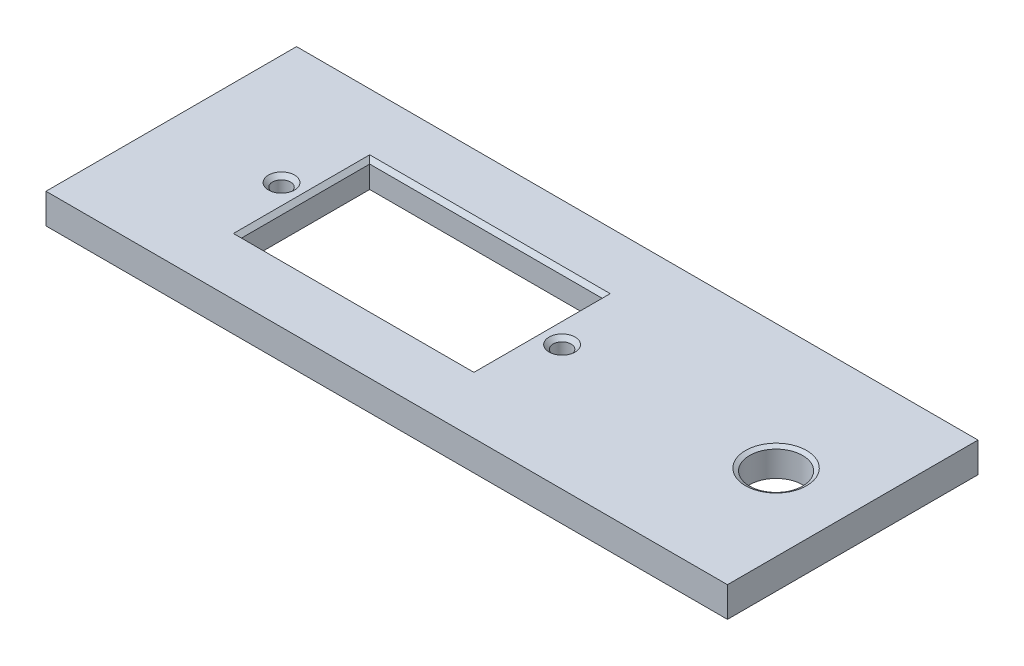
ISO-10303-21;
HEADER;
FILE_DESCRIPTION(('STEP AP214'),'2;1');
FILE_NAME('part.step','',(''),(''),'','','');
FILE_SCHEMA(('AUTOMOTIVE_DESIGN { 1 0 10303 214 1 1 1 1 }'));
ENDSEC;
DATA;
#1=APPLICATION_CONTEXT('core data for automotive mechanical design processes');
#2=APPLICATION_PROTOCOL_DEFINITION('international standard','automotive_design',2000,#1);
#3=PRODUCT_CONTEXT('',#1,'mechanical');
#4=PRODUCT('Part','Part','',(#3));
#5=PRODUCT_RELATED_PRODUCT_CATEGORY('part','',(#4));
#6=PRODUCT_DEFINITION_FORMATION('','',#4);
#7=PRODUCT_DEFINITION_CONTEXT('part definition',#1,'design');
#8=PRODUCT_DEFINITION('design','',#6,#7);
#9=PRODUCT_DEFINITION_SHAPE('','',#8);
#10=(LENGTH_UNIT() NAMED_UNIT(*) SI_UNIT(.MILLI.,.METRE.));
#11=(NAMED_UNIT(*) PLANE_ANGLE_UNIT() SI_UNIT($,.RADIAN.));
#12=(NAMED_UNIT(*) SI_UNIT($,.STERADIAN.) SOLID_ANGLE_UNIT());
#13=UNCERTAINTY_MEASURE_WITH_UNIT(LENGTH_MEASURE(1.E-05),#10,'distance_accuracy_value','');
#14=(GEOMETRIC_REPRESENTATION_CONTEXT(3) GLOBAL_UNCERTAINTY_ASSIGNED_CONTEXT((#13)) GLOBAL_UNIT_ASSIGNED_CONTEXT((#10,
#11,#12)) REPRESENTATION_CONTEXT('',''));
#15=CARTESIAN_POINT('',(0.,0.,0.));
#16=DIRECTION('',(0.,0.,1.));
#17=DIRECTION('',(1.,0.,0.));
#18=AXIS2_PLACEMENT_3D('',#15,#16,#17);
#19=CARTESIAN_POINT('',(0.,3.,12.5));
#20=DIRECTION('',(0.,0.,-1.));
#21=DIRECTION('',(-1.,0.,0.));
#22=AXIS2_PLACEMENT_3D('',#19,#20,#21);
#23=PLANE('',#22);
#24=DIRECTION('',(1.,0.,0.));
#25=VECTOR('',#24,1.);
#26=CARTESIAN_POINT('',(0.,0.,12.5));
#27=LINE('',#26,#25);
#28=CARTESIAN_POINT('',(-25.,0.,12.5));
#29=VERTEX_POINT('',#28);
#30=CARTESIAN_POINT('',(43.,0.,12.5));
#31=VERTEX_POINT('',#30);
#32=EDGE_CURVE('E220',#29,#31,#27,.T.);
#33=ORIENTED_EDGE('',*,*,#32,.T.);
#34=DIRECTION('',(0.,1.,0.));
#35=VECTOR('',#34,1.);
#36=CARTESIAN_POINT('',(43.,-30.8058436014987,12.5));
#37=LINE('',#36,#35);
#38=CARTESIAN_POINT('',(43.,3.,12.5));
#39=VERTEX_POINT('',#38);
#40=EDGE_CURVE('E157',#31,#39,#37,.T.);
#41=ORIENTED_EDGE('',*,*,#40,.T.);
#42=DIRECTION('',(1.,0.,0.));
#43=VECTOR('',#42,1.);
#44=CARTESIAN_POINT('',(0.,3.,12.5));
#45=LINE('',#44,#43);
#46=CARTESIAN_POINT('',(-25.,3.,12.5));
#47=VERTEX_POINT('',#46);
#48=EDGE_CURVE('E147',#47,#39,#45,.T.);
#49=ORIENTED_EDGE('',*,*,#48,.F.);
#50=DIRECTION('',(0.,-1.,0.));
#51=VECTOR('',#50,1.);
#52=CARTESIAN_POINT('',(-25.,3.,12.5));
#53=LINE('',#52,#51);
#54=EDGE_CURVE('E179',#47,#29,#53,.T.);
#55=ORIENTED_EDGE('',*,*,#54,.T.);
#56=EDGE_LOOP('',(#33,#41,#49,#55));
#57=FACE_BOUND('',#56,.T.);
#58=ADVANCED_FACE('F45',(#57),#23,.F.);
#59=CARTESIAN_POINT('',(0.,3.,-12.5));
#60=DIRECTION('',(0.,0.,-1.));
#61=DIRECTION('',(-1.,0.,0.));
#62=AXIS2_PLACEMENT_3D('',#59,#60,#61);
#63=PLANE('',#62);
#64=DIRECTION('',(1.,0.,0.));
#65=VECTOR('',#64,1.);
#66=CARTESIAN_POINT('',(0.,0.,-12.5));
#67=LINE('',#66,#65);
#68=CARTESIAN_POINT('',(-25.,0.,-12.5));
#69=VERTEX_POINT('',#68);
#70=CARTESIAN_POINT('',(43.,0.,-12.5));
#71=VERTEX_POINT('',#70);
#72=EDGE_CURVE('E224',#69,#71,#67,.T.);
#73=ORIENTED_EDGE('',*,*,#72,.F.);
#74=DIRECTION('',(0.,-1.,0.));
#75=VECTOR('',#74,1.);
#76=CARTESIAN_POINT('',(-25.,3.,-12.5));
#77=LINE('',#76,#75);
#78=CARTESIAN_POINT('',(-25.,3.,-12.5));
#79=VERTEX_POINT('',#78);
#80=EDGE_CURVE('E141',#79,#69,#77,.T.);
#81=ORIENTED_EDGE('',*,*,#80,.F.);
#82=DIRECTION('',(1.,0.,0.));
#83=VECTOR('',#82,1.);
#84=CARTESIAN_POINT('',(0.,3.,-12.5));
#85=LINE('',#84,#83);
#86=CARTESIAN_POINT('',(43.,3.,-12.5));
#87=VERTEX_POINT('',#86);
#88=EDGE_CURVE('E136',#79,#87,#85,.T.);
#89=ORIENTED_EDGE('',*,*,#88,.T.);
#90=DIRECTION('',(0.,1.,0.));
#91=VECTOR('',#90,1.);
#92=CARTESIAN_POINT('',(43.,-30.8058436014987,-12.5));
#93=LINE('',#92,#91);
#94=EDGE_CURVE('E139',#71,#87,#93,.T.);
#95=ORIENTED_EDGE('',*,*,#94,.F.);
#96=EDGE_LOOP('',(#73,#81,#89,#95));
#97=FACE_BOUND('',#96,.T.);
#98=ADVANCED_FACE('F138',(#97),#63,.T.);
#99=CARTESIAN_POINT('',(0.,3.,0.));
#100=DIRECTION('',(0.,1.,0.));
#101=DIRECTION('',(0.,0.,1.));
#102=AXIS2_PLACEMENT_3D('',#99,#100,#101);
#103=PLANE('',#102);
#104=CARTESIAN_POINT('',(35.35,3.,0.));
#105=DIRECTION('',(0.,1.,0.));
#106=DIRECTION('',(0.,0.,1.));
#107=AXIS2_PLACEMENT_3D('',#104,#105,#106);
#108=CIRCLE('',#107,3.05000000000001);
#109=CARTESIAN_POINT('',(35.35,3.,3.05000000000001));
#110=VERTEX_POINT('',#109);
#111=EDGE_CURVE('E54',#110,#110,#108,.F.);
#112=ORIENTED_EDGE('',*,*,#111,.T.);
#113=EDGE_LOOP('',(#112));
#114=FACE_BOUND('',#113,.T.);
#115=DIRECTION('',(-1.,0.,0.));
#116=VECTOR('',#115,1.);
#117=CARTESIAN_POINT('',(0.,3.,6.8));
#118=LINE('',#117,#116);
#119=CARTESIAN_POINT('',(12.,3.,6.8));
#120=VERTEX_POINT('',#119);
#121=CARTESIAN_POINT('',(-12.,3.,6.8));
#122=VERTEX_POINT('',#121);
#123=EDGE_CURVE('E237',#120,#122,#118,.T.);
#124=ORIENTED_EDGE('',*,*,#123,.T.);
#125=DIRECTION('',(0.,0.,1.));
#126=VECTOR('',#125,1.);
#127=CARTESIAN_POINT('',(-12.,3.,6.4));
#128=LINE('',#127,#126);
#129=CARTESIAN_POINT('',(-12.,3.,-6.8));
#130=VERTEX_POINT('',#129);
#131=EDGE_CURVE('E188',#130,#122,#128,.T.);
#132=ORIENTED_EDGE('',*,*,#131,.F.);
#133=DIRECTION('',(1.,0.,0.));
#134=VECTOR('',#133,1.);
#135=CARTESIAN_POINT('',(11.6,3.,-6.8));
#136=LINE('',#135,#134);
#137=CARTESIAN_POINT('',(12.,3.,-6.8));
#138=VERTEX_POINT('',#137);
#139=EDGE_CURVE('E233',#130,#138,#136,.T.);
#140=ORIENTED_EDGE('',*,*,#139,.T.);
#141=DIRECTION('',(0.,0.,1.));
#142=VECTOR('',#141,1.);
#143=CARTESIAN_POINT('',(12.,3.,6.4));
#144=LINE('',#143,#142);
#145=EDGE_CURVE('E235',#138,#120,#144,.T.);
#146=ORIENTED_EDGE('',*,*,#145,.T.);
#147=EDGE_LOOP('',(#124,#132,#140,#146));
#148=FACE_BOUND('',#147,.T.);
#149=CARTESIAN_POINT('',(14.,3.,0.));
#150=DIRECTION('',(0.,1.,0.));
#151=DIRECTION('',(0.,0.,1.));
#152=AXIS2_PLACEMENT_3D('',#149,#150,#151);
#153=CIRCLE('',#152,1.3);
#154=CARTESIAN_POINT('',(14.,3.,1.3));
#155=VERTEX_POINT('',#154);
#156=EDGE_CURVE('E239',#155,#155,#153,.F.);
#157=ORIENTED_EDGE('',*,*,#156,.T.);
#158=EDGE_LOOP('',(#157));
#159=FACE_BOUND('',#158,.T.);
#160=DIRECTION('',(0.,0.,-1.));
#161=VECTOR('',#160,1.);
#162=CARTESIAN_POINT('',(-25.,3.,0.));
#163=LINE('',#162,#161);
#164=EDGE_CURVE('E174',#47,#79,#163,.T.);
#165=ORIENTED_EDGE('',*,*,#164,.F.);
#166=ORIENTED_EDGE('',*,*,#48,.T.);
#167=DIRECTION('',(0.,0.,1.));
#168=VECTOR('',#167,1.);
#169=CARTESIAN_POINT('',(43.,3.,0.));
#170=LINE('',#169,#168);
#171=EDGE_CURVE('E154',#87,#39,#170,.T.);
#172=ORIENTED_EDGE('',*,*,#171,.F.);
#173=ORIENTED_EDGE('',*,*,#88,.F.);
#174=EDGE_LOOP('',(#165,#166,#172,#173));
#175=FACE_BOUND('',#174,.T.);
#176=CARTESIAN_POINT('',(-14.,3.,0.));
#177=DIRECTION('',(0.,-1.,0.));
#178=DIRECTION('',(0.,0.,1.));
#179=AXIS2_PLACEMENT_3D('',#176,#177,#178);
#180=CIRCLE('',#179,1.3);
#181=CARTESIAN_POINT('',(-14.,3.,1.3));
#182=VERTEX_POINT('',#181);
#183=EDGE_CURVE('E191',#182,#182,#180,.F.);
#184=ORIENTED_EDGE('',*,*,#183,.F.);
#185=EDGE_LOOP('',(#184));
#186=FACE_BOUND('',#185,.T.);
#187=ADVANCED_FACE('F159',(#114,#148,#159,#175,#186),#103,.T.);
#188=CARTESIAN_POINT('',(0.,0.,0.));
#189=DIRECTION('',(0.,1.,0.));
#190=DIRECTION('',(0.,0.,1.));
#191=AXIS2_PLACEMENT_3D('',#188,#189,#190);
#192=PLANE('',#191);
#193=CARTESIAN_POINT('',(35.35,0.,0.));
#194=DIRECTION('',(0.,1.,0.));
#195=DIRECTION('',(0.,0.,1.));
#196=AXIS2_PLACEMENT_3D('',#193,#194,#195);
#197=CIRCLE('',#196,3.05);
#198=CARTESIAN_POINT('',(35.35,0.,3.05));
#199=VERTEX_POINT('',#198);
#200=EDGE_CURVE('E11',#199,#199,#197,.T.);
#201=ORIENTED_EDGE('',*,*,#200,.T.);
#202=EDGE_LOOP('',(#201));
#203=FACE_BOUND('',#202,.T.);
#204=DIRECTION('',(0.,0.,-1.));
#205=VECTOR('',#204,1.);
#206=CARTESIAN_POINT('',(-12.,0.,0.));
#207=LINE('',#206,#205);
#208=CARTESIAN_POINT('',(-12.,0.,6.8));
#209=VERTEX_POINT('',#208);
#210=CARTESIAN_POINT('',(-12.,0.,-6.8));
#211=VERTEX_POINT('',#210);
#212=EDGE_CURVE('E194',#209,#211,#207,.T.);
#213=ORIENTED_EDGE('',*,*,#212,.F.);
#214=DIRECTION('',(1.,0.,0.));
#215=VECTOR('',#214,1.);
#216=CARTESIAN_POINT('',(0.,0.,6.8));
#217=LINE('',#216,#215);
#218=CARTESIAN_POINT('',(12.,0.,6.8));
#219=VERTEX_POINT('',#218);
#220=EDGE_CURVE('E246',#209,#219,#217,.T.);
#221=ORIENTED_EDGE('',*,*,#220,.T.);
#222=DIRECTION('',(0.,0.,-1.));
#223=VECTOR('',#222,1.);
#224=CARTESIAN_POINT('',(12.,0.,0.));
#225=LINE('',#224,#223);
#226=CARTESIAN_POINT('',(12.,0.,-6.8));
#227=VERTEX_POINT('',#226);
#228=EDGE_CURVE('E244',#219,#227,#225,.T.);
#229=ORIENTED_EDGE('',*,*,#228,.T.);
#230=DIRECTION('',(-1.,0.,0.));
#231=VECTOR('',#230,1.);
#232=CARTESIAN_POINT('',(0.,0.,-6.8));
#233=LINE('',#232,#231);
#234=EDGE_CURVE('E242',#227,#211,#233,.T.);
#235=ORIENTED_EDGE('',*,*,#234,.T.);
#236=EDGE_LOOP('',(#213,#221,#229,#235));
#237=FACE_BOUND('',#236,.T.);
#238=CARTESIAN_POINT('',(14.,0.,0.));
#239=DIRECTION('',(0.,1.,0.));
#240=DIRECTION('',(0.,0.,1.));
#241=AXIS2_PLACEMENT_3D('',#238,#239,#240);
#242=CIRCLE('',#241,1.30000000000001);
#243=CARTESIAN_POINT('',(14.,0.,-1.30000000000001));
#244=VERTEX_POINT('',#243);
#245=EDGE_CURVE('E249',#244,#244,#242,.T.);
#246=ORIENTED_EDGE('',*,*,#245,.T.);
#247=EDGE_LOOP('',(#246));
#248=FACE_BOUND('',#247,.T.);
#249=ORIENTED_EDGE('',*,*,#32,.F.);
#250=DIRECTION('',(0.,0.,-1.));
#251=VECTOR('',#250,1.);
#252=CARTESIAN_POINT('',(-25.,0.,0.));
#253=LINE('',#252,#251);
#254=EDGE_CURVE('E169',#29,#69,#253,.T.);
#255=ORIENTED_EDGE('',*,*,#254,.T.);
#256=ORIENTED_EDGE('',*,*,#72,.T.);
#257=DIRECTION('',(0.,0.,-1.));
#258=VECTOR('',#257,1.);
#259=CARTESIAN_POINT('',(43.,0.,0.));
#260=LINE('',#259,#258);
#261=EDGE_CURVE('E156',#31,#71,#260,.T.);
#262=ORIENTED_EDGE('',*,*,#261,.F.);
#263=EDGE_LOOP('',(#249,#255,#256,#262));
#264=FACE_BOUND('',#263,.T.);
#265=CARTESIAN_POINT('',(-14.,0.,0.));
#266=DIRECTION('',(0.,-1.,0.));
#267=DIRECTION('',(0.,0.,1.));
#268=AXIS2_PLACEMENT_3D('',#265,#266,#267);
#269=CIRCLE('',#268,1.30000000000001);
#270=CARTESIAN_POINT('',(-14.,0.,-1.30000000000001));
#271=VERTEX_POINT('',#270);
#272=EDGE_CURVE('E197',#271,#271,#269,.T.);
#273=ORIENTED_EDGE('',*,*,#272,.F.);
#274=EDGE_LOOP('',(#273));
#275=FACE_BOUND('',#274,.T.);
#276=ADVANCED_FACE('F403',(#203,#237,#248,#264,#275),#192,.F.);
#277=CARTESIAN_POINT('',(14.,0.,0.));
#278=DIRECTION('',(0.,1.,0.));
#279=DIRECTION('',(0.,0.,1.));
#280=AXIS2_PLACEMENT_3D('',#277,#278,#279);
#281=CYLINDRICAL_SURFACE('',#280,0.9);
#282=CARTESIAN_POINT('',(14.,2.6,0.));
#283=DIRECTION('',(0.,1.,0.));
#284=DIRECTION('',(0.,0.,1.));
#285=AXIS2_PLACEMENT_3D('',#282,#283,#284);
#286=CIRCLE('',#285,0.9);
#287=CARTESIAN_POINT('',(14.,2.6,0.9));
#288=VERTEX_POINT('',#287);
#289=EDGE_CURVE('E230',#288,#288,#286,.T.);
#290=ORIENTED_EDGE('',*,*,#289,.T.);
#291=EDGE_LOOP('',(#290));
#292=FACE_BOUND('',#291,.T.);
#293=CARTESIAN_POINT('',(14.,0.400000000000009,0.));
#294=DIRECTION('',(0.,1.,0.));
#295=DIRECTION('',(0.,0.,1.));
#296=AXIS2_PLACEMENT_3D('',#293,#294,#295);
#297=CIRCLE('',#296,0.9);
#298=CARTESIAN_POINT('',(14.,0.400000000000009,-0.9));
#299=VERTEX_POINT('',#298);
#300=EDGE_CURVE('E146',#299,#299,#297,.F.);
#301=ORIENTED_EDGE('',*,*,#300,.T.);
#302=EDGE_LOOP('',(#301));
#303=FACE_BOUND('',#302,.T.);
#304=ADVANCED_FACE('F406',(#292,#303),#281,.F.);
#305=CARTESIAN_POINT('',(11.6,0.,6.4));
#306=DIRECTION('',(1.,0.,0.));
#307=DIRECTION('',(0.,0.,-1.));
#308=AXIS2_PLACEMENT_3D('',#305,#306,#307);
#309=PLANE('',#308);
#310=DIRECTION('',(0.,1.,0.));
#311=VECTOR('',#310,1.);
#312=CARTESIAN_POINT('',(11.6,0.,-6.4));
#313=LINE('',#312,#311);
#314=CARTESIAN_POINT('',(11.6,0.400000000000001,-6.4));
#315=VERTEX_POINT('',#314);
#316=CARTESIAN_POINT('',(11.6,2.6,-6.4));
#317=VERTEX_POINT('',#316);
#318=EDGE_CURVE('E221',#315,#317,#313,.T.);
#319=ORIENTED_EDGE('',*,*,#318,.F.);
#320=DIRECTION('',(0.,0.,1.));
#321=VECTOR('',#320,1.);
#322=CARTESIAN_POINT('',(11.6,0.400000000000001,6.4));
#323=LINE('',#322,#321);
#324=CARTESIAN_POINT('',(11.6,0.400000000000001,6.4));
#325=VERTEX_POINT('',#324);
#326=EDGE_CURVE('E258',#315,#325,#323,.T.);
#327=ORIENTED_EDGE('',*,*,#326,.T.);
#328=DIRECTION('',(0.,1.,0.));
#329=VECTOR('',#328,1.);
#330=CARTESIAN_POINT('',(11.6,0.,6.4));
#331=LINE('',#330,#329);
#332=CARTESIAN_POINT('',(11.6,2.6,6.4));
#333=VERTEX_POINT('',#332);
#334=EDGE_CURVE('E218',#325,#333,#331,.T.);
#335=ORIENTED_EDGE('',*,*,#334,.T.);
#336=DIRECTION('',(0.,0.,-1.));
#337=VECTOR('',#336,1.);
#338=CARTESIAN_POINT('',(11.6,2.6,-6.4));
#339=LINE('',#338,#337);
#340=EDGE_CURVE('E61',#333,#317,#339,.T.);
#341=ORIENTED_EDGE('',*,*,#340,.T.);
#342=EDGE_LOOP('',(#319,#327,#335,#341));
#343=FACE_BOUND('',#342,.T.);
#344=ADVANCED_FACE('F393',(#343),#309,.F.);
#345=CARTESIAN_POINT('',(-11.6,0.,6.4));
#346=DIRECTION('',(0.,0.,1.));
#347=DIRECTION('',(1.,0.,0.));
#348=AXIS2_PLACEMENT_3D('',#345,#346,#347);
#349=PLANE('',#348);
#350=ORIENTED_EDGE('',*,*,#334,.F.);
#351=DIRECTION('',(-1.,0.,0.));
#352=VECTOR('',#351,1.);
#353=CARTESIAN_POINT('',(-11.6,0.400000000000001,6.4));
#354=LINE('',#353,#352);
#355=CARTESIAN_POINT('',(-11.6,0.400000000000001,6.4));
#356=VERTEX_POINT('',#355);
#357=EDGE_CURVE('E255',#325,#356,#354,.T.);
#358=ORIENTED_EDGE('',*,*,#357,.T.);
#359=DIRECTION('',(0.,1.,0.));
#360=VECTOR('',#359,1.);
#361=CARTESIAN_POINT('',(-11.6,0.,6.4));
#362=LINE('',#361,#360);
#363=CARTESIAN_POINT('',(-11.6,2.6,6.4));
#364=VERTEX_POINT('',#363);
#365=EDGE_CURVE('E166',#356,#364,#362,.T.);
#366=ORIENTED_EDGE('',*,*,#365,.T.);
#367=DIRECTION('',(1.,0.,0.));
#368=VECTOR('',#367,1.);
#369=CARTESIAN_POINT('',(11.6,2.6,6.4));
#370=LINE('',#369,#368);
#371=EDGE_CURVE('E252',#364,#333,#370,.T.);
#372=ORIENTED_EDGE('',*,*,#371,.T.);
#373=EDGE_LOOP('',(#350,#358,#366,#372));
#374=FACE_BOUND('',#373,.T.);
#375=ADVANCED_FACE('F386',(#374),#349,.F.);
#376=CARTESIAN_POINT('',(-11.6,0.,-6.4));
#377=DIRECTION('',(0.,0.,-1.));
#378=DIRECTION('',(-1.,0.,0.));
#379=AXIS2_PLACEMENT_3D('',#376,#377,#378);
#380=PLANE('',#379);
#381=DIRECTION('',(-1.,0.,0.));
#382=VECTOR('',#381,1.);
#383=CARTESIAN_POINT('',(0.,2.6,-6.4));
#384=LINE('',#383,#382);
#385=CARTESIAN_POINT('',(-11.6,2.6,-6.4));
#386=VERTEX_POINT('',#385);
#387=EDGE_CURVE('E260',#317,#386,#384,.T.);
#388=ORIENTED_EDGE('',*,*,#387,.T.);
#389=DIRECTION('',(0.,1.,0.));
#390=VECTOR('',#389,1.);
#391=CARTESIAN_POINT('',(-11.6,0.,-6.4));
#392=LINE('',#391,#390);
#393=CARTESIAN_POINT('',(-11.6,0.400000000000001,-6.4));
#394=VERTEX_POINT('',#393);
#395=EDGE_CURVE('E170',#394,#386,#392,.T.);
#396=ORIENTED_EDGE('',*,*,#395,.F.);
#397=DIRECTION('',(1.,0.,0.));
#398=VECTOR('',#397,1.);
#399=CARTESIAN_POINT('',(-11.6,0.400000000000001,-6.4));
#400=LINE('',#399,#398);
#401=EDGE_CURVE('E68',#394,#315,#400,.T.);
#402=ORIENTED_EDGE('',*,*,#401,.T.);
#403=ORIENTED_EDGE('',*,*,#318,.T.);
#404=EDGE_LOOP('',(#388,#396,#402,#403));
#405=FACE_BOUND('',#404,.T.);
#406=ADVANCED_FACE('F316',(#405),#380,.F.);
#407=CARTESIAN_POINT('',(14.,2.6,0.));
#408=DIRECTION('',(0.,1.,0.));
#409=DIRECTION('',(0.,0.,1.));
#410=AXIS2_PLACEMENT_3D('',#407,#408,#409);
#411=CONICAL_SURFACE('',#410,0.9,0.785398163397449);
#412=ORIENTED_EDGE('',*,*,#156,.F.);
#413=EDGE_LOOP('',(#412));
#414=FACE_BOUND('',#413,.T.);
#415=ORIENTED_EDGE('',*,*,#289,.F.);
#416=EDGE_LOOP('',(#415));
#417=FACE_BOUND('',#416,.T.);
#418=ADVANCED_FACE('F309',(#414,#417),#411,.F.);
#419=CARTESIAN_POINT('',(14.,0.,0.));
#420=DIRECTION('',(0.,-1.,0.));
#421=DIRECTION('',(0.,0.,-1.));
#422=AXIS2_PLACEMENT_3D('',#419,#420,#421);
#423=CONICAL_SURFACE('',#422,1.30000000000001,0.785398163397444);
#424=CARTESIAN_POINT('',(14.,0.400000000000009,-0.9));
#425=CARTESIAN_POINT('',(14.,0.395833333333343,-0.904166666666667));
#426=CARTESIAN_POINT('',(14.,0.391666666666676,-0.908333333333334));
#427=CARTESIAN_POINT('',(14.,0.383333333333342,-0.916666666666667));
#428=CARTESIAN_POINT('',(14.,0.379166666666675,-0.920833333333334));
#429=CARTESIAN_POINT('',(14.,0.370833333333342,-0.929166666666667));
#430=CARTESIAN_POINT('',(14.,0.366666666666675,-0.933333333333334));
#431=CARTESIAN_POINT('',(14.,0.358333333333342,-0.941666666666667));
#432=CARTESIAN_POINT('',(14.,0.354166666666675,-0.945833333333334));
#433=CARTESIAN_POINT('',(14.,0.345833333333341,-0.954166666666668));
#434=CARTESIAN_POINT('',(14.,0.341666666666675,-0.958333333333334));
#435=CARTESIAN_POINT('',(14.,0.333333333333341,-0.966666666666668));
#436=CARTESIAN_POINT('',(14.,0.329166666666674,-0.970833333333335));
#437=CARTESIAN_POINT('',(14.,0.320833333333341,-0.979166666666668));
#438=CARTESIAN_POINT('',(14.,0.316666666666674,-0.983333333333335));
#439=CARTESIAN_POINT('',(14.,0.308333333333341,-0.991666666666668));
#440=CARTESIAN_POINT('',(14.,0.304166666666674,-0.995833333333335));
#441=CARTESIAN_POINT('',(14.,0.29583333333334,-1.00416666666667));
#442=CARTESIAN_POINT('',(14.,0.291666666666673,-1.00833333333334));
#443=CARTESIAN_POINT('',(14.,0.28333333333334,-1.01666666666667));
#444=CARTESIAN_POINT('',(14.,0.279166666666673,-1.02083333333334));
#445=CARTESIAN_POINT('',(14.,0.27083333333334,-1.02916666666667));
#446=CARTESIAN_POINT('',(14.,0.266666666666673,-1.03333333333334));
#447=CARTESIAN_POINT('',(14.,0.258333333333339,-1.04166666666667));
#448=CARTESIAN_POINT('',(14.,0.254166666666673,-1.04583333333334));
#449=CARTESIAN_POINT('',(14.,0.245833333333339,-1.05416666666667));
#450=CARTESIAN_POINT('',(14.,0.241666666666672,-1.05833333333334));
#451=CARTESIAN_POINT('',(14.,0.233333333333339,-1.06666666666667));
#452=CARTESIAN_POINT('',(14.,0.229166666666672,-1.07083333333334));
#453=CARTESIAN_POINT('',(14.,0.220833333333338,-1.07916666666667));
#454=CARTESIAN_POINT('',(14.,0.216666666666672,-1.08333333333334));
#455=CARTESIAN_POINT('',(14.,0.208333333333338,-1.09166666666667));
#456=CARTESIAN_POINT('',(14.,0.204166666666671,-1.09583333333334));
#457=CARTESIAN_POINT('',(14.,0.195833333333338,-1.10416666666667));
#458=CARTESIAN_POINT('',(14.,0.191666666666671,-1.10833333333334));
#459=CARTESIAN_POINT('',(14.,0.183333333333338,-1.11666666666667));
#460=CARTESIAN_POINT('',(14.,0.179166666666671,-1.12083333333334));
#461=CARTESIAN_POINT('',(14.,0.170833333333337,-1.12916666666667));
#462=CARTESIAN_POINT('',(14.,0.166666666666671,-1.13333333333334));
#463=CARTESIAN_POINT('',(14.,0.158333333333337,-1.14166666666667));
#464=CARTESIAN_POINT('',(14.,0.15416666666667,-1.14583333333334));
#465=CARTESIAN_POINT('',(14.,0.145833333333337,-1.15416666666667));
#466=CARTESIAN_POINT('',(14.,0.14166666666667,-1.15833333333334));
#467=CARTESIAN_POINT('',(14.,0.133333333333336,-1.16666666666667));
#468=CARTESIAN_POINT('',(14.,0.12916666666667,-1.17083333333334));
#469=CARTESIAN_POINT('',(14.,0.120833333333336,-1.17916666666667));
#470=CARTESIAN_POINT('',(14.,0.116666666666669,-1.18333333333334));
#471=CARTESIAN_POINT('',(14.,0.108333333333336,-1.19166666666667));
#472=CARTESIAN_POINT('',(14.,0.104166666666669,-1.19583333333334));
#473=CARTESIAN_POINT('',(14.,0.0958333333333356,-1.20416666666667));
#474=CARTESIAN_POINT('',(14.,0.0916666666666688,-1.20833333333334));
#475=CARTESIAN_POINT('',(14.,0.0833333333333353,-1.21666666666667));
#476=CARTESIAN_POINT('',(14.,0.0791666666666685,-1.22083333333334));
#477=CARTESIAN_POINT('',(14.,0.070833333333335,-1.22916666666667));
#478=CARTESIAN_POINT('',(14.,0.0666666666666682,-1.23333333333334));
#479=CARTESIAN_POINT('',(14.,0.0583333333333347,-1.24166666666667));
#480=CARTESIAN_POINT('',(14.,0.0541666666666679,-1.24583333333334));
#481=CARTESIAN_POINT('',(14.,0.0458333333333344,-1.25416666666667));
#482=CARTESIAN_POINT('',(14.,0.0416666666666676,-1.25833333333334));
#483=CARTESIAN_POINT('',(14.,0.0333333333333341,-1.26666666666667));
#484=CARTESIAN_POINT('',(14.,0.0291666666666674,-1.27083333333334));
#485=CARTESIAN_POINT('',(14.,0.0208333333333338,-1.27916666666667));
#486=CARTESIAN_POINT('',(14.,0.0166666666666671,-1.28333333333334));
#487=CARTESIAN_POINT('',(14.,0.00833333333333353,-1.29166666666667));
#488=CARTESIAN_POINT('',(14.,0.00416666666666677,-1.29583333333334));
#489=CARTESIAN_POINT('',(14.,0.,-1.30000000000001));
#490=B_SPLINE_CURVE_WITH_KNOTS('',3,(#424,#425,#426,#427,#428,#429,#430,#431,#432,#433,#434,
#435,#436,#437,#438,#439,#440,#441,#442,#443,#444,#445,#446,#447,#448,#449,#450,#451,#452,#453,
#454,#455,#456,#457,#458,#459,#460,#461,#462,#463,#464,#465,#466,#467,#468,#469,#470,#471,#472,
#473,#474,#475,#476,#477,#478,#479,#480,#481,#482,#483,#484,#485,#486,#487,#488,#489),
.UNSPECIFIED.,.F.,.F.,(4,2,2,2,2,2,2,2,2,2,2,2,2,2,2,2,2,2,2,2,2,2,2,2,2,2,2,2,2,2,2,2,4),(0.,
0.017677669529664,0.0353553390593281,0.053033008588992,0.0707106781186561,0.0883883476483201,
0.106066017177984,0.123743686707648,0.141421356237312,0.159099025766976,0.17677669529664,
0.194454364826304,0.212132034355968,0.229809703885632,0.247487373415296,0.26516504294496,
0.282842712474624,0.300520382004288,0.318198051533952,0.335875721063617,0.353553390593281,
0.371231060122944,0.388908729652608,0.406586399182272,0.424264068711937,0.441941738241601,
0.459619407771265,0.477297077300929,0.494974746830593,0.512652416360257,0.530330085889921,
0.548007755419585,0.565685424949249),.UNSPECIFIED.);
#491=EDGE_CURVE('BSEAM315',#299,#244,#490,.T.);
#492=ORIENTED_EDGE('',*,*,#300,.F.);
#493=ORIENTED_EDGE('',*,*,#245,.F.);
#494=ORIENTED_EDGE('',*,*,#491,.T.);
#495=ORIENTED_EDGE('',*,*,#491,.F.);
#496=EDGE_LOOP('',(#492,#494,#493,#495));
#497=FACE_BOUND('',#496,.T.);
#498=ADVANCED_FACE('F315',(#497),#423,.F.);
#499=CARTESIAN_POINT('',(0.,0.,-6.8));
#500=DIRECTION('',(0.,0.707106781186544,-0.707106781186551));
#501=DIRECTION('',(-1.,0.,0.));
#502=AXIS2_PLACEMENT_3D('',#499,#500,#501);
#503=PLANE('',#502);
#504=ORIENTED_EDGE('',*,*,#401,.F.);
#505=DIRECTION('',(0.577350269189624,0.577350269189629,0.577350269189624));
#506=VECTOR('',#505,1.);
#507=CARTESIAN_POINT('',(-9.73333333333334,2.26666666666667,-4.53333333333335));
#508=LINE('',#507,#506);
#509=EDGE_CURVE('E173',#394,#211,#508,.F.);
#510=ORIENTED_EDGE('',*,*,#509,.T.);
#511=ORIENTED_EDGE('',*,*,#234,.F.);
#512=DIRECTION('',(-0.577350269189624,0.577350269189629,0.577350269189624));
#513=VECTOR('',#512,1.);
#514=CARTESIAN_POINT('',(9.73333333333334,2.26666666666667,-4.53333333333335));
#515=LINE('',#514,#513);
#516=EDGE_CURVE('E223',#315,#227,#515,.F.);
#517=ORIENTED_EDGE('',*,*,#516,.F.);
#518=EDGE_LOOP('',(#504,#510,#511,#517));
#519=FACE_BOUND('',#518,.T.);
#520=ADVANCED_FACE('F323',(#519),#503,.F.);
#521=CARTESIAN_POINT('',(12.,0.,0.));
#522=DIRECTION('',(0.707106781186551,0.707106781186544,0.));
#523=DIRECTION('',(0.,0.,-1.));
#524=AXIS2_PLACEMENT_3D('',#521,#522,#523);
#525=PLANE('',#524);
#526=ORIENTED_EDGE('',*,*,#516,.T.);
#527=ORIENTED_EDGE('',*,*,#228,.F.);
#528=DIRECTION('',(-0.577350269189624,0.577350269189629,-0.577350269189624));
#529=VECTOR('',#528,1.);
#530=CARTESIAN_POINT('',(8.00000000000002,4.00000000000001,2.80000000000002));
#531=LINE('',#530,#529);
#532=EDGE_CURVE('E264',#325,#219,#531,.F.);
#533=ORIENTED_EDGE('',*,*,#532,.F.);
#534=ORIENTED_EDGE('',*,*,#326,.F.);
#535=EDGE_LOOP('',(#526,#527,#533,#534));
#536=FACE_BOUND('',#535,.T.);
#537=ADVANCED_FACE('F334',(#536),#525,.F.);
#538=CARTESIAN_POINT('',(0.,0.,6.8));
#539=DIRECTION('',(0.,0.707106781186544,0.707106781186551));
#540=DIRECTION('',(1.,0.,0.));
#541=AXIS2_PLACEMENT_3D('',#538,#539,#540);
#542=PLANE('',#541);
#543=ORIENTED_EDGE('',*,*,#220,.F.);
#544=DIRECTION('',(0.577350269189624,0.577350269189629,-0.577350269189624));
#545=VECTOR('',#544,1.);
#546=CARTESIAN_POINT('',(-8.00000000000002,4.00000000000001,2.80000000000002));
#547=LINE('',#546,#545);
#548=EDGE_CURVE('E207',#356,#209,#547,.F.);
#549=ORIENTED_EDGE('',*,*,#548,.F.);
#550=ORIENTED_EDGE('',*,*,#357,.F.);
#551=ORIENTED_EDGE('',*,*,#532,.T.);
#552=EDGE_LOOP('',(#543,#549,#550,#551));
#553=FACE_BOUND('',#552,.T.);
#554=ADVANCED_FACE('F326',(#553),#542,.F.);
#555=CARTESIAN_POINT('',(-11.6,2.6,-6.4));
#556=DIRECTION('',(0.,0.707106781186551,0.707106781186544));
#557=DIRECTION('',(1.,0.,0.));
#558=AXIS2_PLACEMENT_3D('',#555,#556,#557);
#559=PLANE('',#558);
#560=ORIENTED_EDGE('',*,*,#139,.F.);
#561=DIRECTION('',(-0.577350269189627,0.577350269189622,-0.577350269189627));
#562=VECTOR('',#561,1.);
#563=CARTESIAN_POINT('',(-7.33333333333331,-1.66666666666665,-2.13333333333331));
#564=LINE('',#563,#562);
#565=EDGE_CURVE('E210',#130,#386,#564,.F.);
#566=ORIENTED_EDGE('',*,*,#565,.T.);
#567=ORIENTED_EDGE('',*,*,#387,.F.);
#568=DIRECTION('',(0.577350269189627,0.577350269189622,-0.577350269189627));
#569=VECTOR('',#568,1.);
#570=CARTESIAN_POINT('',(7.33333333333331,-1.66666666666665,-2.13333333333331));
#571=LINE('',#570,#569);
#572=EDGE_CURVE('E266',#138,#317,#571,.F.);
#573=ORIENTED_EDGE('',*,*,#572,.F.);
#574=EDGE_LOOP('',(#560,#566,#567,#573));
#575=FACE_BOUND('',#574,.T.);
#576=ADVANCED_FACE('F333',(#575),#559,.T.);
#577=CARTESIAN_POINT('',(11.6,2.6,6.4));
#578=DIRECTION('',(-0.707106781186544,0.707106781186551,0.));
#579=DIRECTION('',(0.,0.,1.));
#580=AXIS2_PLACEMENT_3D('',#577,#578,#579);
#581=PLANE('',#580);
#582=ORIENTED_EDGE('',*,*,#572,.T.);
#583=ORIENTED_EDGE('',*,*,#340,.F.);
#584=DIRECTION('',(0.577350269189627,0.577350269189622,0.577350269189627));
#585=VECTOR('',#584,1.);
#586=CARTESIAN_POINT('',(3.86666666666662,-5.13333333333331,-1.33333333333338));
#587=LINE('',#586,#585);
#588=EDGE_CURVE('E206',#120,#333,#587,.F.);
#589=ORIENTED_EDGE('',*,*,#588,.F.);
#590=ORIENTED_EDGE('',*,*,#145,.F.);
#591=EDGE_LOOP('',(#582,#583,#589,#590));
#592=FACE_BOUND('',#591,.T.);
#593=ADVANCED_FACE('F355',(#592),#581,.T.);
#594=CARTESIAN_POINT('',(-11.6,2.6,6.4));
#595=DIRECTION('',(0.,0.707106781186551,-0.707106781186544));
#596=DIRECTION('',(-1.,0.,0.));
#597=AXIS2_PLACEMENT_3D('',#594,#595,#596);
#598=PLANE('',#597);
#599=ORIENTED_EDGE('',*,*,#371,.F.);
#600=DIRECTION('',(-0.577350269189627,0.577350269189622,0.577350269189627));
#601=VECTOR('',#600,1.);
#602=CARTESIAN_POINT('',(-3.86666666666662,-5.13333333333331,-1.33333333333338));
#603=LINE('',#602,#601);
#604=EDGE_CURVE('E213',#122,#364,#603,.F.);
#605=ORIENTED_EDGE('',*,*,#604,.F.);
#606=ORIENTED_EDGE('',*,*,#123,.F.);
#607=ORIENTED_EDGE('',*,*,#588,.T.);
#608=EDGE_LOOP('',(#599,#605,#606,#607));
#609=FACE_BOUND('',#608,.T.);
#610=ADVANCED_FACE('F347',(#609),#598,.T.);
#611=CARTESIAN_POINT('',(-25.,3.,0.));
#612=DIRECTION('',(1.,0.,0.));
#613=DIRECTION('',(0.,0.,1.));
#614=AXIS2_PLACEMENT_3D('',#611,#612,#613);
#615=PLANE('',#614);
#616=ORIENTED_EDGE('',*,*,#254,.F.);
#617=ORIENTED_EDGE('',*,*,#54,.F.);
#618=ORIENTED_EDGE('',*,*,#164,.T.);
#619=ORIENTED_EDGE('',*,*,#80,.T.);
#620=EDGE_LOOP('',(#616,#617,#618,#619));
#621=FACE_BOUND('',#620,.T.);
#622=ADVANCED_FACE('F354',(#621),#615,.F.);
#623=CARTESIAN_POINT('',(-14.,0.,0.));
#624=DIRECTION('',(0.,1.,0.));
#625=DIRECTION('',(0.,0.,1.));
#626=AXIS2_PLACEMENT_3D('',#623,#624,#625);
#627=CYLINDRICAL_SURFACE('',#626,0.9);
#628=CARTESIAN_POINT('',(-14.,2.6,0.));
#629=DIRECTION('',(0.,-1.,0.));
#630=DIRECTION('',(0.,0.,1.));
#631=AXIS2_PLACEMENT_3D('',#628,#629,#630);
#632=CIRCLE('',#631,0.9);
#633=CARTESIAN_POINT('',(-14.,2.6,0.9));
#634=VERTEX_POINT('',#633);
#635=EDGE_CURVE('E185',#634,#634,#632,.T.);
#636=ORIENTED_EDGE('',*,*,#635,.F.);
#637=EDGE_LOOP('',(#636));
#638=FACE_BOUND('',#637,.T.);
#639=CARTESIAN_POINT('',(-14.,0.400000000000009,0.));
#640=DIRECTION('',(0.,-1.,0.));
#641=DIRECTION('',(0.,0.,1.));
#642=AXIS2_PLACEMENT_3D('',#639,#640,#641);
#643=CIRCLE('',#642,0.9);
#644=CARTESIAN_POINT('',(-14.,0.400000000000009,-0.9));
#645=VERTEX_POINT('',#644);
#646=EDGE_CURVE('E182',#645,#645,#643,.F.);
#647=ORIENTED_EDGE('',*,*,#646,.F.);
#648=EDGE_LOOP('',(#647));
#649=FACE_BOUND('',#648,.T.);
#650=ADVANCED_FACE('F498',(#638,#649),#627,.F.);
#651=CARTESIAN_POINT('',(-11.6,0.,6.4));
#652=DIRECTION('',(-1.,0.,0.));
#653=DIRECTION('',(0.,0.,-1.));
#654=AXIS2_PLACEMENT_3D('',#651,#652,#653);
#655=PLANE('',#654);
#656=ORIENTED_EDGE('',*,*,#395,.T.);
#657=DIRECTION('',(0.,0.,-1.));
#658=VECTOR('',#657,1.);
#659=CARTESIAN_POINT('',(-11.6,2.6,-6.4));
#660=LINE('',#659,#658);
#661=EDGE_CURVE('E200',#364,#386,#660,.T.);
#662=ORIENTED_EDGE('',*,*,#661,.F.);
#663=ORIENTED_EDGE('',*,*,#365,.F.);
#664=DIRECTION('',(0.,0.,1.));
#665=VECTOR('',#664,1.);
#666=CARTESIAN_POINT('',(-11.6,0.400000000000001,6.4));
#667=LINE('',#666,#665);
#668=EDGE_CURVE('E203',#394,#356,#667,.T.);
#669=ORIENTED_EDGE('',*,*,#668,.F.);
#670=EDGE_LOOP('',(#656,#662,#663,#669));
#671=FACE_BOUND('',#670,.T.);
#672=ADVANCED_FACE('F391',(#671),#655,.F.);
#673=CARTESIAN_POINT('',(-14.,2.6,0.));
#674=DIRECTION('',(0.,1.,0.));
#675=DIRECTION('',(0.,0.,1.));
#676=AXIS2_PLACEMENT_3D('',#673,#674,#675);
#677=CONICAL_SURFACE('',#676,0.9,0.785398163397449);
#678=ORIENTED_EDGE('',*,*,#183,.T.);
#679=EDGE_LOOP('',(#678));
#680=FACE_BOUND('',#679,.T.);
#681=ORIENTED_EDGE('',*,*,#635,.T.);
#682=EDGE_LOOP('',(#681));
#683=FACE_BOUND('',#682,.T.);
#684=ADVANCED_FACE('F416',(#680,#683),#677,.F.);
#685=CARTESIAN_POINT('',(-14.,0.,0.));
#686=DIRECTION('',(0.,-1.,0.));
#687=DIRECTION('',(0.,0.,-1.));
#688=AXIS2_PLACEMENT_3D('',#685,#686,#687);
#689=CONICAL_SURFACE('',#688,1.30000000000001,0.785398163397444);
#690=CARTESIAN_POINT('',(-14.,0.400000000000009,-0.9));
#691=CARTESIAN_POINT('',(-14.,0.395833333333343,-0.904166666666667));
#692=CARTESIAN_POINT('',(-14.,0.391666666666676,-0.908333333333334));
#693=CARTESIAN_POINT('',(-14.,0.383333333333342,-0.916666666666667));
#694=CARTESIAN_POINT('',(-14.,0.379166666666675,-0.920833333333334));
#695=CARTESIAN_POINT('',(-14.,0.370833333333342,-0.929166666666667));
#696=CARTESIAN_POINT('',(-14.,0.366666666666675,-0.933333333333334));
#697=CARTESIAN_POINT('',(-14.,0.358333333333342,-0.941666666666667));
#698=CARTESIAN_POINT('',(-14.,0.354166666666675,-0.945833333333334));
#699=CARTESIAN_POINT('',(-14.,0.345833333333341,-0.954166666666668));
#700=CARTESIAN_POINT('',(-14.,0.341666666666675,-0.958333333333334));
#701=CARTESIAN_POINT('',(-14.,0.333333333333341,-0.966666666666668));
#702=CARTESIAN_POINT('',(-14.,0.329166666666674,-0.970833333333335));
#703=CARTESIAN_POINT('',(-14.,0.320833333333341,-0.979166666666668));
#704=CARTESIAN_POINT('',(-14.,0.316666666666674,-0.983333333333335));
#705=CARTESIAN_POINT('',(-14.,0.308333333333341,-0.991666666666668));
#706=CARTESIAN_POINT('',(-14.,0.304166666666674,-0.995833333333335));
#707=CARTESIAN_POINT('',(-14.,0.29583333333334,-1.00416666666667));
#708=CARTESIAN_POINT('',(-14.,0.291666666666673,-1.00833333333334));
#709=CARTESIAN_POINT('',(-14.,0.28333333333334,-1.01666666666667));
#710=CARTESIAN_POINT('',(-14.,0.279166666666673,-1.02083333333334));
#711=CARTESIAN_POINT('',(-14.,0.27083333333334,-1.02916666666667));
#712=CARTESIAN_POINT('',(-14.,0.266666666666673,-1.03333333333334));
#713=CARTESIAN_POINT('',(-14.,0.258333333333339,-1.04166666666667));
#714=CARTESIAN_POINT('',(-14.,0.254166666666673,-1.04583333333334));
#715=CARTESIAN_POINT('',(-14.,0.245833333333339,-1.05416666666667));
#716=CARTESIAN_POINT('',(-14.,0.241666666666672,-1.05833333333334));
#717=CARTESIAN_POINT('',(-14.,0.233333333333339,-1.06666666666667));
#718=CARTESIAN_POINT('',(-14.,0.229166666666672,-1.07083333333334));
#719=CARTESIAN_POINT('',(-14.,0.220833333333338,-1.07916666666667));
#720=CARTESIAN_POINT('',(-14.,0.216666666666672,-1.08333333333334));
#721=CARTESIAN_POINT('',(-14.,0.208333333333338,-1.09166666666667));
#722=CARTESIAN_POINT('',(-14.,0.204166666666671,-1.09583333333334));
#723=CARTESIAN_POINT('',(-14.,0.195833333333338,-1.10416666666667));
#724=CARTESIAN_POINT('',(-14.,0.191666666666671,-1.10833333333334));
#725=CARTESIAN_POINT('',(-14.,0.183333333333338,-1.11666666666667));
#726=CARTESIAN_POINT('',(-14.,0.179166666666671,-1.12083333333334));
#727=CARTESIAN_POINT('',(-14.,0.170833333333337,-1.12916666666667));
#728=CARTESIAN_POINT('',(-14.,0.166666666666671,-1.13333333333334));
#729=CARTESIAN_POINT('',(-14.,0.158333333333337,-1.14166666666667));
#730=CARTESIAN_POINT('',(-14.,0.15416666666667,-1.14583333333334));
#731=CARTESIAN_POINT('',(-14.,0.145833333333337,-1.15416666666667));
#732=CARTESIAN_POINT('',(-14.,0.14166666666667,-1.15833333333334));
#733=CARTESIAN_POINT('',(-14.,0.133333333333336,-1.16666666666667));
#734=CARTESIAN_POINT('',(-14.,0.12916666666667,-1.17083333333334));
#735=CARTESIAN_POINT('',(-14.,0.120833333333336,-1.17916666666667));
#736=CARTESIAN_POINT('',(-14.,0.116666666666669,-1.18333333333334));
#737=CARTESIAN_POINT('',(-14.,0.108333333333336,-1.19166666666667));
#738=CARTESIAN_POINT('',(-14.,0.104166666666669,-1.19583333333334));
#739=CARTESIAN_POINT('',(-14.,0.0958333333333356,-1.20416666666667));
#740=CARTESIAN_POINT('',(-14.,0.0916666666666688,-1.20833333333334));
#741=CARTESIAN_POINT('',(-14.,0.0833333333333353,-1.21666666666667));
#742=CARTESIAN_POINT('',(-14.,0.0791666666666685,-1.22083333333334));
#743=CARTESIAN_POINT('',(-14.,0.070833333333335,-1.22916666666667));
#744=CARTESIAN_POINT('',(-14.,0.0666666666666682,-1.23333333333334));
#745=CARTESIAN_POINT('',(-14.,0.0583333333333347,-1.24166666666667));
#746=CARTESIAN_POINT('',(-14.,0.0541666666666679,-1.24583333333334));
#747=CARTESIAN_POINT('',(-14.,0.0458333333333344,-1.25416666666667));
#748=CARTESIAN_POINT('',(-14.,0.0416666666666676,-1.25833333333334));
#749=CARTESIAN_POINT('',(-14.,0.0333333333333341,-1.26666666666667));
#750=CARTESIAN_POINT('',(-14.,0.0291666666666674,-1.27083333333334));
#751=CARTESIAN_POINT('',(-14.,0.0208333333333338,-1.27916666666667));
#752=CARTESIAN_POINT('',(-14.,0.0166666666666671,-1.28333333333334));
#753=CARTESIAN_POINT('',(-14.,0.00833333333333353,-1.29166666666667));
#754=CARTESIAN_POINT('',(-14.,0.00416666666666677,-1.29583333333334));
#755=CARTESIAN_POINT('',(-14.,0.,-1.30000000000001));
#756=B_SPLINE_CURVE_WITH_KNOTS('',3,(#690,#691,#692,#693,#694,#695,#696,#697,#698,#699,#700,
#701,#702,#703,#704,#705,#706,#707,#708,#709,#710,#711,#712,#713,#714,#715,#716,#717,#718,#719,
#720,#721,#722,#723,#724,#725,#726,#727,#728,#729,#730,#731,#732,#733,#734,#735,#736,#737,#738,
#739,#740,#741,#742,#743,#744,#745,#746,#747,#748,#749,#750,#751,#752,#753,#754,#755),
.UNSPECIFIED.,.F.,.F.,(4,2,2,2,2,2,2,2,2,2,2,2,2,2,2,2,2,2,2,2,2,2,2,2,2,2,2,2,2,2,2,2,4),(0.,
0.017677669529664,0.0353553390593281,0.053033008588992,0.0707106781186561,0.0883883476483201,
0.106066017177984,0.123743686707648,0.141421356237312,0.159099025766976,0.17677669529664,
0.194454364826304,0.212132034355968,0.229809703885632,0.247487373415296,0.26516504294496,
0.282842712474624,0.300520382004288,0.318198051533952,0.335875721063617,0.353553390593281,
0.371231060122944,0.388908729652608,0.406586399182272,0.424264068711937,0.441941738241601,
0.459619407771265,0.477297077300929,0.494974746830593,0.512652416360257,0.530330085889921,
0.548007755419585,0.565685424949249),.UNSPECIFIED.);
#757=EDGE_CURVE('BSEAM414',#645,#271,#756,.T.);
#758=ORIENTED_EDGE('',*,*,#646,.T.);
#759=ORIENTED_EDGE('',*,*,#272,.T.);
#760=ORIENTED_EDGE('',*,*,#757,.T.);
#761=ORIENTED_EDGE('',*,*,#757,.F.);
#762=EDGE_LOOP('',(#758,#760,#759,#761));
#763=FACE_BOUND('',#762,.T.);
#764=ADVANCED_FACE('F414',(#763),#689,.F.);
#765=CARTESIAN_POINT('',(-12.,0.,0.));
#766=DIRECTION('',(-0.707106781186551,0.707106781186544,0.));
#767=DIRECTION('',(0.,0.,-1.));
#768=AXIS2_PLACEMENT_3D('',#765,#766,#767);
#769=PLANE('',#768);
#770=ORIENTED_EDGE('',*,*,#509,.F.);
#771=ORIENTED_EDGE('',*,*,#668,.T.);
#772=ORIENTED_EDGE('',*,*,#548,.T.);
#773=ORIENTED_EDGE('',*,*,#212,.T.);
#774=EDGE_LOOP('',(#770,#771,#772,#773));
#775=FACE_BOUND('',#774,.T.);
#776=ADVANCED_FACE('F401',(#775),#769,.F.);
#777=CARTESIAN_POINT('',(-11.6,2.6,6.4));
#778=DIRECTION('',(0.707106781186544,0.707106781186551,0.));
#779=DIRECTION('',(0.,0.,1.));
#780=AXIS2_PLACEMENT_3D('',#777,#778,#779);
#781=PLANE('',#780);
#782=ORIENTED_EDGE('',*,*,#565,.F.);
#783=ORIENTED_EDGE('',*,*,#131,.T.);
#784=ORIENTED_EDGE('',*,*,#604,.T.);
#785=ORIENTED_EDGE('',*,*,#661,.T.);
#786=EDGE_LOOP('',(#782,#783,#784,#785));
#787=FACE_BOUND('',#786,.T.);
#788=ADVANCED_FACE('F289',(#787),#781,.T.);
#789=CARTESIAN_POINT('',(35.35,-30.8058436014987,0.));
#790=DIRECTION('',(0.,1.,0.));
#791=DIRECTION('',(0.,0.,1.));
#792=AXIS2_PLACEMENT_3D('',#789,#790,#791);
#793=CYLINDRICAL_SURFACE('',#792,2.65);
#794=CARTESIAN_POINT('',(35.35,2.76905989232415,0.));
#795=DIRECTION('',(0.,1.,0.));
#796=DIRECTION('',(0.,0.,1.));
#797=AXIS2_PLACEMENT_3D('',#794,#795,#796);
#798=CIRCLE('',#797,2.65);
#799=CARTESIAN_POINT('',(35.35,2.76905989232415,2.65));
#800=VERTEX_POINT('',#799);
#801=EDGE_CURVE('E274',#800,#800,#798,.T.);
#802=ORIENTED_EDGE('',*,*,#801,.T.);
#803=EDGE_LOOP('',(#802));
#804=FACE_BOUND('',#803,.T.);
#805=CARTESIAN_POINT('',(35.35,0.230940107675843,0.));
#806=DIRECTION('',(0.,1.,0.));
#807=DIRECTION('',(0.,0.,1.));
#808=AXIS2_PLACEMENT_3D('',#805,#806,#807);
#809=CIRCLE('',#808,2.65);
#810=CARTESIAN_POINT('',(35.35,0.230940107675843,2.65));
#811=VERTEX_POINT('',#810);
#812=EDGE_CURVE('E263',#811,#811,#809,.F.);
#813=ORIENTED_EDGE('',*,*,#812,.T.);
#814=EDGE_LOOP('',(#813));
#815=FACE_BOUND('',#814,.T.);
#816=ADVANCED_FACE('F286',(#804,#815),#793,.F.);
#817=CARTESIAN_POINT('',(43.,-30.8058436014987,0.));
#818=DIRECTION('',(-1.,0.,0.));
#819=DIRECTION('',(0.,0.,1.));
#820=AXIS2_PLACEMENT_3D('',#817,#818,#819);
#821=PLANE('',#820);
#822=ORIENTED_EDGE('',*,*,#40,.F.);
#823=ORIENTED_EDGE('',*,*,#261,.T.);
#824=ORIENTED_EDGE('',*,*,#94,.T.);
#825=ORIENTED_EDGE('',*,*,#171,.T.);
#826=EDGE_LOOP('',(#822,#823,#824,#825));
#827=FACE_BOUND('',#826,.T.);
#828=ADVANCED_FACE('F153',(#827),#821,.F.);
#829=CARTESIAN_POINT('',(35.35,2.76905989232415,0.));
#830=DIRECTION('',(0.,1.,0.));
#831=DIRECTION('',(0.,0.,1.));
#832=AXIS2_PLACEMENT_3D('',#829,#830,#831);
#833=CONICAL_SURFACE('',#832,2.65,1.0471975511966);
#834=ORIENTED_EDGE('',*,*,#111,.F.);
#835=EDGE_LOOP('',(#834));
#836=FACE_BOUND('',#835,.T.);
#837=ORIENTED_EDGE('',*,*,#801,.F.);
#838=EDGE_LOOP('',(#837));
#839=FACE_BOUND('',#838,.T.);
#840=ADVANCED_FACE('F281',(#836,#839),#833,.F.);
#841=CARTESIAN_POINT('',(35.35,0.230940107675843,0.));
#842=DIRECTION('',(0.,-1.,0.));
#843=DIRECTION('',(0.,0.,-1.));
#844=AXIS2_PLACEMENT_3D('',#841,#842,#843);
#845=CONICAL_SURFACE('',#844,2.65,1.04719755119661);
#846=ORIENTED_EDGE('',*,*,#200,.F.);
#847=EDGE_LOOP('',(#846));
#848=FACE_BOUND('',#847,.T.);
#849=ORIENTED_EDGE('',*,*,#812,.F.);
#850=EDGE_LOOP('',(#849));
#851=FACE_BOUND('',#850,.T.);
#852=ADVANCED_FACE('F48',(#848,#851),#845,.F.);
#853=CLOSED_SHELL('',(#58,#98,#187,#276,#304,#344,#375,#406,#418,#498,#520,#537,#554,#576,#593,
#610,#622,#650,#672,#684,#764,#776,#788,#816,#828,#840,#852));
#854=MANIFOLD_SOLID_BREP('B2',#853);
#855=ADVANCED_BREP_SHAPE_REPRESENTATION('',(#18,#854),#14);
#856=SHAPE_DEFINITION_REPRESENTATION(#9,#855);
ENDSEC;
END-ISO-10303-21;
